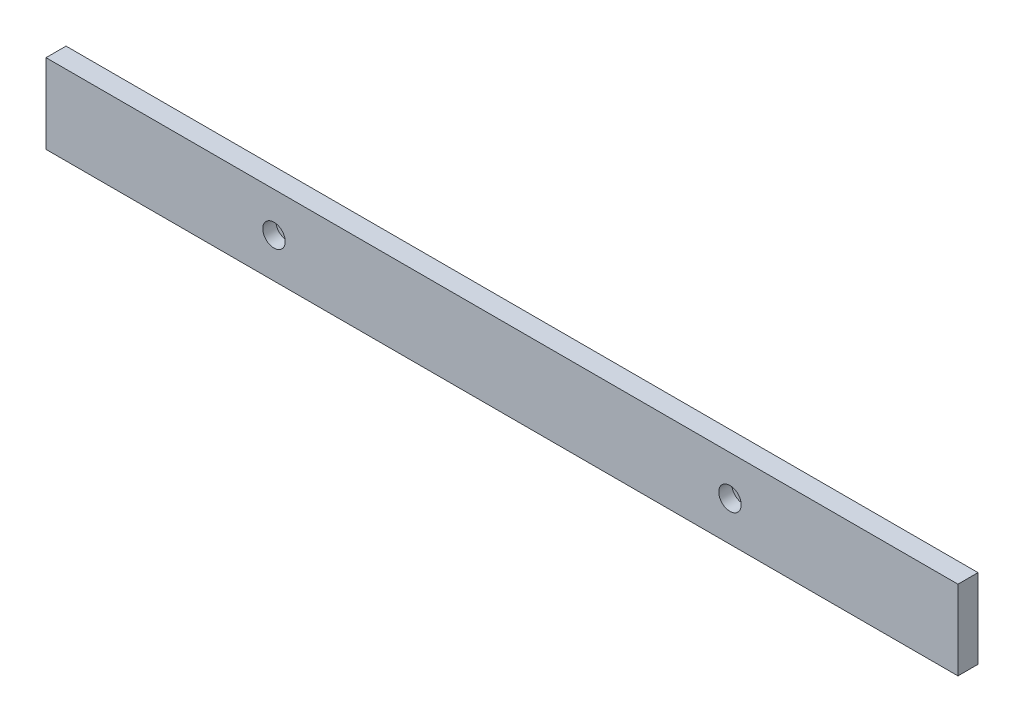
ISO-10303-21;
HEADER;
FILE_DESCRIPTION(('STEP AP214'),'2;1');
FILE_NAME('part.step','',(''),(''),'','','');
FILE_SCHEMA(('AUTOMOTIVE_DESIGN { 1 0 10303 214 1 1 1 1 }'));
ENDSEC;
DATA;
#1=APPLICATION_CONTEXT('core data for automotive mechanical design processes');
#2=APPLICATION_PROTOCOL_DEFINITION('international standard','automotive_design',2000,#1);
#3=PRODUCT_CONTEXT('',#1,'mechanical');
#4=PRODUCT('Part','Part','',(#3));
#5=PRODUCT_RELATED_PRODUCT_CATEGORY('part','',(#4));
#6=PRODUCT_DEFINITION_FORMATION('','',#4);
#7=PRODUCT_DEFINITION_CONTEXT('part definition',#1,'design');
#8=PRODUCT_DEFINITION('design','',#6,#7);
#9=PRODUCT_DEFINITION_SHAPE('','',#8);
#10=(LENGTH_UNIT() NAMED_UNIT(*) SI_UNIT(.MILLI.,.METRE.));
#11=(NAMED_UNIT(*) PLANE_ANGLE_UNIT() SI_UNIT($,.RADIAN.));
#12=(NAMED_UNIT(*) SI_UNIT($,.STERADIAN.) SOLID_ANGLE_UNIT());
#13=UNCERTAINTY_MEASURE_WITH_UNIT(LENGTH_MEASURE(1.E-05),#10,'distance_accuracy_value','');
#14=(GEOMETRIC_REPRESENTATION_CONTEXT(3) GLOBAL_UNCERTAINTY_ASSIGNED_CONTEXT((#13)) GLOBAL_UNIT_ASSIGNED_CONTEXT((#10,
#11,#12)) REPRESENTATION_CONTEXT('',''));
#15=CARTESIAN_POINT('',(0.,0.,0.));
#16=DIRECTION('',(0.,0.,1.));
#17=DIRECTION('',(1.,0.,0.));
#18=AXIS2_PLACEMENT_3D('',#15,#16,#17);
#19=CARTESIAN_POINT('',(-66.,0.,5.8));
#20=DIRECTION('',(0.,0.,-1.));
#21=DIRECTION('',(-1.,0.,0.));
#22=AXIS2_PLACEMENT_3D('',#19,#20,#21);
#23=CYLINDRICAL_SURFACE('',#22,1.5);
#24=CARTESIAN_POINT('',(-66.,0.,0.));
#25=DIRECTION('',(0.,0.,1.));
#26=DIRECTION('',(1.,0.,0.));
#27=AXIS2_PLACEMENT_3D('',#24,#25,#26);
#28=CIRCLE('',#27,1.5);
#29=CARTESIAN_POINT('',(-64.5,0.,0.));
#30=VERTEX_POINT('',#29);
#31=EDGE_CURVE('E105',#30,#30,#28,.T.);
#32=ORIENTED_EDGE('',*,*,#31,.F.);
#33=EDGE_LOOP('',(#32));
#34=FACE_BOUND('',#33,.T.);
#35=CARTESIAN_POINT('',(-66.,0.,2.));
#36=DIRECTION('',(0.,0.,1.));
#37=DIRECTION('',(1.,0.,0.));
#38=AXIS2_PLACEMENT_3D('',#35,#36,#37);
#39=CIRCLE('',#38,1.5);
#40=CARTESIAN_POINT('',(-64.5,0.,2.));
#41=VERTEX_POINT('',#40);
#42=EDGE_CURVE('E39',#41,#41,#39,.T.);
#43=ORIENTED_EDGE('',*,*,#42,.T.);
#44=EDGE_LOOP('',(#43));
#45=FACE_BOUND('',#44,.T.);
#46=ADVANCED_FACE('F35',(#34,#45),#23,.F.);
#47=CARTESIAN_POINT('',(66.,0.,5.8));
#48=DIRECTION('',(0.,0.,-1.));
#49=DIRECTION('',(-1.,0.,0.));
#50=AXIS2_PLACEMENT_3D('',#47,#48,#49);
#51=CYLINDRICAL_SURFACE('',#50,1.5);
#52=CARTESIAN_POINT('',(66.,0.,0.));
#53=DIRECTION('',(0.,0.,1.));
#54=DIRECTION('',(1.,0.,0.));
#55=AXIS2_PLACEMENT_3D('',#52,#53,#54);
#56=CIRCLE('',#55,1.5);
#57=CARTESIAN_POINT('',(67.5,0.,0.));
#58=VERTEX_POINT('',#57);
#59=EDGE_CURVE('E116',#58,#58,#56,.T.);
#60=ORIENTED_EDGE('',*,*,#59,.F.);
#61=EDGE_LOOP('',(#60));
#62=FACE_BOUND('',#61,.T.);
#63=CARTESIAN_POINT('',(66.,0.,2.));
#64=DIRECTION('',(0.,0.,1.));
#65=DIRECTION('',(1.,0.,0.));
#66=AXIS2_PLACEMENT_3D('',#63,#64,#65);
#67=CIRCLE('',#66,1.5);
#68=CARTESIAN_POINT('',(67.5,0.,2.));
#69=VERTEX_POINT('',#68);
#70=EDGE_CURVE('E110',#69,#69,#67,.T.);
#71=ORIENTED_EDGE('',*,*,#70,.T.);
#72=EDGE_LOOP('',(#71));
#73=FACE_BOUND('',#72,.T.);
#74=ADVANCED_FACE('F141',(#62,#73),#51,.F.);
#75=CARTESIAN_POINT('',(0.,0.,5.8));
#76=DIRECTION('',(0.,0.,1.));
#77=DIRECTION('',(1.,0.,0.));
#78=AXIS2_PLACEMENT_3D('',#75,#76,#77);
#79=PLANE('',#78);
#80=CARTESIAN_POINT('',(-66.,0.,5.8));
#81=DIRECTION('',(0.,0.,1.));
#82=DIRECTION('',(1.,0.,0.));
#83=AXIS2_PLACEMENT_3D('',#80,#81,#82);
#84=CIRCLE('',#83,3.25000000000001);
#85=CARTESIAN_POINT('',(-62.75,0.,5.8));
#86=VERTEX_POINT('',#85);
#87=EDGE_CURVE('E118',#86,#86,#84,.T.);
#88=ORIENTED_EDGE('',*,*,#87,.F.);
#89=EDGE_LOOP('',(#88));
#90=FACE_BOUND('',#89,.T.);
#91=CARTESIAN_POINT('',(66.,0.,5.8));
#92=DIRECTION('',(0.,0.,1.));
#93=DIRECTION('',(1.,0.,0.));
#94=AXIS2_PLACEMENT_3D('',#91,#92,#93);
#95=CIRCLE('',#94,3.25000000000001);
#96=CARTESIAN_POINT('',(69.25,0.,5.8));
#97=VERTEX_POINT('',#96);
#98=EDGE_CURVE('E126',#97,#97,#95,.T.);
#99=ORIENTED_EDGE('',*,*,#98,.F.);
#100=EDGE_LOOP('',(#99));
#101=FACE_BOUND('',#100,.T.);
#102=DIRECTION('',(0.,1.,0.));
#103=VECTOR('',#102,1.);
#104=CARTESIAN_POINT('',(132.,11.5,5.8));
#105=LINE('',#104,#103);
#106=CARTESIAN_POINT('',(132.,-11.5,5.8));
#107=VERTEX_POINT('',#106);
#108=CARTESIAN_POINT('',(132.,11.5,5.8));
#109=VERTEX_POINT('',#108);
#110=EDGE_CURVE('E89',#107,#109,#105,.T.);
#111=ORIENTED_EDGE('',*,*,#110,.T.);
#112=DIRECTION('',(-1.,0.,0.));
#113=VECTOR('',#112,1.);
#114=CARTESIAN_POINT('',(-132.,11.5,5.8));
#115=LINE('',#114,#113);
#116=CARTESIAN_POINT('',(-132.,11.5,5.8));
#117=VERTEX_POINT('',#116);
#118=EDGE_CURVE('E84',#109,#117,#115,.T.);
#119=ORIENTED_EDGE('',*,*,#118,.T.);
#120=DIRECTION('',(0.,-1.,0.));
#121=VECTOR('',#120,1.);
#122=CARTESIAN_POINT('',(-132.,11.5,5.8));
#123=LINE('',#122,#121);
#124=CARTESIAN_POINT('',(-132.,-11.5,5.8));
#125=VERTEX_POINT('',#124);
#126=EDGE_CURVE('E87',#117,#125,#123,.T.);
#127=ORIENTED_EDGE('',*,*,#126,.T.);
#128=DIRECTION('',(1.,0.,0.));
#129=VECTOR('',#128,1.);
#130=CARTESIAN_POINT('',(-132.,-11.5,5.8));
#131=LINE('',#130,#129);
#132=EDGE_CURVE('E54',#125,#107,#131,.T.);
#133=ORIENTED_EDGE('',*,*,#132,.T.);
#134=EDGE_LOOP('',(#111,#119,#127,#133));
#135=FACE_BOUND('',#134,.T.);
#136=ADVANCED_FACE('F85',(#90,#101,#135),#79,.T.);
#137=CARTESIAN_POINT('',(0.,0.,0.));
#138=DIRECTION('',(0.,0.,1.));
#139=DIRECTION('',(1.,0.,0.));
#140=AXIS2_PLACEMENT_3D('',#137,#138,#139);
#141=PLANE('',#140);
#142=DIRECTION('',(0.,1.,0.));
#143=VECTOR('',#142,1.);
#144=CARTESIAN_POINT('',(132.,11.5,0.));
#145=LINE('',#144,#143);
#146=CARTESIAN_POINT('',(132.,-11.5,0.));
#147=VERTEX_POINT('',#146);
#148=CARTESIAN_POINT('',(132.,11.5,0.));
#149=VERTEX_POINT('',#148);
#150=EDGE_CURVE('E102',#147,#149,#145,.T.);
#151=ORIENTED_EDGE('',*,*,#150,.F.);
#152=DIRECTION('',(1.,0.,0.));
#153=VECTOR('',#152,1.);
#154=CARTESIAN_POINT('',(-132.,-11.5,0.));
#155=LINE('',#154,#153);
#156=CARTESIAN_POINT('',(-132.,-11.5,0.));
#157=VERTEX_POINT('',#156);
#158=EDGE_CURVE('E77',#157,#147,#155,.T.);
#159=ORIENTED_EDGE('',*,*,#158,.F.);
#160=DIRECTION('',(0.,-1.,0.));
#161=VECTOR('',#160,1.);
#162=CARTESIAN_POINT('',(-132.,11.5,0.));
#163=LINE('',#162,#161);
#164=CARTESIAN_POINT('',(-132.,11.5,0.));
#165=VERTEX_POINT('',#164);
#166=EDGE_CURVE('E71',#165,#157,#163,.T.);
#167=ORIENTED_EDGE('',*,*,#166,.F.);
#168=DIRECTION('',(-1.,0.,0.));
#169=VECTOR('',#168,1.);
#170=CARTESIAN_POINT('',(-132.,11.5,0.));
#171=LINE('',#170,#169);
#172=EDGE_CURVE('E93',#149,#165,#171,.T.);
#173=ORIENTED_EDGE('',*,*,#172,.F.);
#174=EDGE_LOOP('',(#151,#159,#167,#173));
#175=FACE_BOUND('',#174,.T.);
#176=ORIENTED_EDGE('',*,*,#31,.T.);
#177=EDGE_LOOP('',(#176));
#178=FACE_BOUND('',#177,.T.);
#179=ORIENTED_EDGE('',*,*,#59,.T.);
#180=EDGE_LOOP('',(#179));
#181=FACE_BOUND('',#180,.T.);
#182=ADVANCED_FACE('F136',(#175,#178,#181),#141,.F.);
#183=CARTESIAN_POINT('',(132.,11.5,5.8));
#184=DIRECTION('',(-1.,0.,0.));
#185=DIRECTION('',(0.,0.,1.));
#186=AXIS2_PLACEMENT_3D('',#183,#184,#185);
#187=PLANE('',#186);
#188=ORIENTED_EDGE('',*,*,#150,.T.);
#189=DIRECTION('',(0.,0.,-1.));
#190=VECTOR('',#189,1.);
#191=CARTESIAN_POINT('',(132.,11.5,5.8));
#192=LINE('',#191,#190);
#193=EDGE_CURVE('E12',#109,#149,#192,.T.);
#194=ORIENTED_EDGE('',*,*,#193,.F.);
#195=ORIENTED_EDGE('',*,*,#110,.F.);
#196=DIRECTION('',(0.,0.,-1.));
#197=VECTOR('',#196,1.);
#198=CARTESIAN_POINT('',(132.,-11.5,5.8));
#199=LINE('',#198,#197);
#200=EDGE_CURVE('E98',#107,#147,#199,.T.);
#201=ORIENTED_EDGE('',*,*,#200,.T.);
#202=EDGE_LOOP('',(#188,#194,#195,#201));
#203=FACE_BOUND('',#202,.T.);
#204=ADVANCED_FACE('F37',(#203),#187,.F.);
#205=CARTESIAN_POINT('',(-132.,11.5,5.8));
#206=DIRECTION('',(0.,-1.,0.));
#207=DIRECTION('',(0.,0.,-1.));
#208=AXIS2_PLACEMENT_3D('',#205,#206,#207);
#209=PLANE('',#208);
#210=ORIENTED_EDGE('',*,*,#172,.T.);
#211=DIRECTION('',(0.,0.,-1.));
#212=VECTOR('',#211,1.);
#213=CARTESIAN_POINT('',(-132.,11.5,5.8));
#214=LINE('',#213,#212);
#215=EDGE_CURVE('E45',#117,#165,#214,.T.);
#216=ORIENTED_EDGE('',*,*,#215,.F.);
#217=ORIENTED_EDGE('',*,*,#118,.F.);
#218=ORIENTED_EDGE('',*,*,#193,.T.);
#219=EDGE_LOOP('',(#210,#216,#217,#218));
#220=FACE_BOUND('',#219,.T.);
#221=ADVANCED_FACE('F92',(#220),#209,.F.);
#222=CARTESIAN_POINT('',(-132.,11.5,5.8));
#223=DIRECTION('',(1.,0.,0.));
#224=DIRECTION('',(0.,0.,-1.));
#225=AXIS2_PLACEMENT_3D('',#222,#223,#224);
#226=PLANE('',#225);
#227=ORIENTED_EDGE('',*,*,#166,.T.);
#228=DIRECTION('',(0.,0.,-1.));
#229=VECTOR('',#228,1.);
#230=CARTESIAN_POINT('',(-132.,-11.5,5.8));
#231=LINE('',#230,#229);
#232=EDGE_CURVE('E94',#125,#157,#231,.T.);
#233=ORIENTED_EDGE('',*,*,#232,.F.);
#234=ORIENTED_EDGE('',*,*,#126,.F.);
#235=ORIENTED_EDGE('',*,*,#215,.T.);
#236=EDGE_LOOP('',(#227,#233,#234,#235));
#237=FACE_BOUND('',#236,.T.);
#238=ADVANCED_FACE('F96',(#237),#226,.F.);
#239=CARTESIAN_POINT('',(-132.,-11.5,5.8));
#240=DIRECTION('',(0.,1.,0.));
#241=DIRECTION('',(0.,0.,1.));
#242=AXIS2_PLACEMENT_3D('',#239,#240,#241);
#243=PLANE('',#242);
#244=ORIENTED_EDGE('',*,*,#158,.T.);
#245=ORIENTED_EDGE('',*,*,#200,.F.);
#246=ORIENTED_EDGE('',*,*,#132,.F.);
#247=ORIENTED_EDGE('',*,*,#232,.T.);
#248=EDGE_LOOP('',(#244,#245,#246,#247));
#249=FACE_BOUND('',#248,.T.);
#250=ADVANCED_FACE('F162',(#249),#243,.F.);
#251=CARTESIAN_POINT('',(66.,0.,-9.19238815542513));
#252=DIRECTION('',(0.,0.,1.));
#253=DIRECTION('',(1.,0.,0.));
#254=AXIS2_PLACEMENT_3D('',#251,#252,#253);
#255=CYLINDRICAL_SURFACE('',#254,3.25000000000001);
#256=CARTESIAN_POINT('',(66.,0.,2.));
#257=DIRECTION('',(0.,0.,1.));
#258=DIRECTION('',(1.,0.,0.));
#259=AXIS2_PLACEMENT_3D('',#256,#257,#258);
#260=CIRCLE('',#259,3.25000000000001);
#261=CARTESIAN_POINT('',(69.25,0.,2.));
#262=VERTEX_POINT('',#261);
#263=EDGE_CURVE('E123',#262,#262,#260,.F.);
#264=ORIENTED_EDGE('',*,*,#263,.T.);
#265=EDGE_LOOP('',(#264));
#266=FACE_BOUND('',#265,.T.);
#267=ORIENTED_EDGE('',*,*,#98,.T.);
#268=EDGE_LOOP('',(#267));
#269=FACE_BOUND('',#268,.T.);
#270=ADVANCED_FACE('F158',(#266,#269),#255,.F.);
#271=CARTESIAN_POINT('',(0.,0.,2.));
#272=DIRECTION('',(0.,0.,1.));
#273=DIRECTION('',(1.,0.,0.));
#274=AXIS2_PLACEMENT_3D('',#271,#272,#273);
#275=PLANE('',#274);
#276=ORIENTED_EDGE('',*,*,#70,.F.);
#277=EDGE_LOOP('',(#276));
#278=FACE_BOUND('',#277,.T.);
#279=ORIENTED_EDGE('',*,*,#263,.F.);
#280=EDGE_LOOP('',(#279));
#281=FACE_BOUND('',#280,.T.);
#282=ADVANCED_FACE('F153',(#278,#281),#275,.T.);
#283=CARTESIAN_POINT('',(-66.,0.,-9.19238815542513));
#284=DIRECTION('',(0.,0.,1.));
#285=DIRECTION('',(1.,0.,0.));
#286=AXIS2_PLACEMENT_3D('',#283,#284,#285);
#287=CYLINDRICAL_SURFACE('',#286,3.25000000000001);
#288=CARTESIAN_POINT('',(-66.,0.,2.));
#289=DIRECTION('',(0.,0.,1.));
#290=DIRECTION('',(1.,0.,0.));
#291=AXIS2_PLACEMENT_3D('',#288,#289,#290);
#292=CIRCLE('',#291,3.25000000000001);
#293=CARTESIAN_POINT('',(-62.75,0.,2.));
#294=VERTEX_POINT('',#293);
#295=EDGE_CURVE('E112',#294,#294,#292,.F.);
#296=ORIENTED_EDGE('',*,*,#295,.T.);
#297=EDGE_LOOP('',(#296));
#298=FACE_BOUND('',#297,.T.);
#299=ORIENTED_EDGE('',*,*,#87,.T.);
#300=EDGE_LOOP('',(#299));
#301=FACE_BOUND('',#300,.T.);
#302=ADVANCED_FACE('F148',(#298,#301),#287,.F.);
#303=CARTESIAN_POINT('',(0.,0.,2.));
#304=DIRECTION('',(0.,0.,1.));
#305=DIRECTION('',(1.,0.,0.));
#306=AXIS2_PLACEMENT_3D('',#303,#304,#305);
#307=PLANE('',#306);
#308=ORIENTED_EDGE('',*,*,#42,.F.);
#309=EDGE_LOOP('',(#308));
#310=FACE_BOUND('',#309,.T.);
#311=ORIENTED_EDGE('',*,*,#295,.F.);
#312=EDGE_LOOP('',(#311));
#313=FACE_BOUND('',#312,.T.);
#314=ADVANCED_FACE('F145',(#310,#313),#307,.T.);
#315=CLOSED_SHELL('',(#46,#74,#136,#182,#204,#221,#238,#250,#270,#282,#302,#314));
#316=MANIFOLD_SOLID_BREP('B2',#315);
#317=ADVANCED_BREP_SHAPE_REPRESENTATION('',(#18,#316),#14);
#318=SHAPE_DEFINITION_REPRESENTATION(#9,#317);
ENDSEC;
END-ISO-10303-21;
